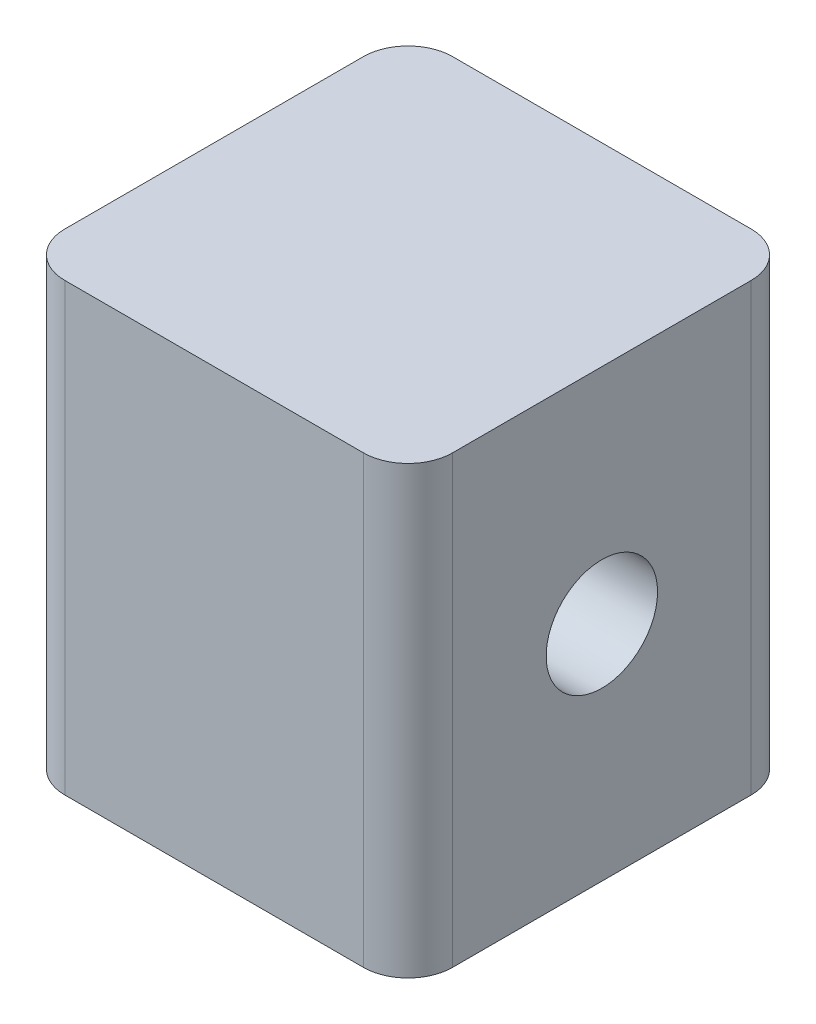
ISO-10303-21;
HEADER;
FILE_DESCRIPTION(('STEP AP214'),'2;1');
FILE_NAME('part.step','',(''),(''),'','','');
FILE_SCHEMA(('AUTOMOTIVE_DESIGN { 1 0 10303 214 1 1 1 1 }'));
ENDSEC;
DATA;
#1=APPLICATION_CONTEXT('core data for automotive mechanical design processes');
#2=APPLICATION_PROTOCOL_DEFINITION('international standard','automotive_design',2000,#1);
#3=PRODUCT_CONTEXT('',#1,'mechanical');
#4=PRODUCT('Part','Part','',(#3));
#5=PRODUCT_RELATED_PRODUCT_CATEGORY('part','',(#4));
#6=PRODUCT_DEFINITION_FORMATION('','',#4);
#7=PRODUCT_DEFINITION_CONTEXT('part definition',#1,'design');
#8=PRODUCT_DEFINITION('design','',#6,#7);
#9=PRODUCT_DEFINITION_SHAPE('','',#8);
#10=(LENGTH_UNIT() NAMED_UNIT(*) SI_UNIT(.MILLI.,.METRE.));
#11=(NAMED_UNIT(*) PLANE_ANGLE_UNIT() SI_UNIT($,.RADIAN.));
#12=(NAMED_UNIT(*) SI_UNIT($,.STERADIAN.) SOLID_ANGLE_UNIT());
#13=UNCERTAINTY_MEASURE_WITH_UNIT(LENGTH_MEASURE(1.E-05),#10,'distance_accuracy_value','');
#14=(GEOMETRIC_REPRESENTATION_CONTEXT(3) GLOBAL_UNCERTAINTY_ASSIGNED_CONTEXT((#13)) GLOBAL_UNIT_ASSIGNED_CONTEXT((#10,
#11,#12)) REPRESENTATION_CONTEXT('',''));
#15=CARTESIAN_POINT('',(0.,0.,0.));
#16=DIRECTION('',(0.,0.,1.));
#17=DIRECTION('',(1.,0.,0.));
#18=AXIS2_PLACEMENT_3D('',#15,#16,#17);
#19=CARTESIAN_POINT('',(11.049,12.7,11.049));
#20=DIRECTION('',(-1.,0.,0.));
#21=DIRECTION('',(0.,0.,1.));
#22=AXIS2_PLACEMENT_3D('',#19,#20,#21);
#23=PLANE('',#22);
#24=CARTESIAN_POINT('',(11.049,0.,0.));
#25=DIRECTION('',(1.,0.,0.));
#26=DIRECTION('',(0.,0.,-1.));
#27=AXIS2_PLACEMENT_3D('',#24,#25,#26);
#28=CIRCLE('',#27,3.175);
#29=CARTESIAN_POINT('',(11.049,0.,-3.175));
#30=VERTEX_POINT('',#29);
#31=EDGE_CURVE('E171',#30,#30,#28,.T.);
#32=ORIENTED_EDGE('',*,*,#31,.F.);
#33=EDGE_LOOP('',(#32));
#34=FACE_BOUND('',#33,.T.);
#35=DIRECTION('',(0.,0.,-1.));
#36=VECTOR('',#35,1.);
#37=CARTESIAN_POINT('',(11.049,12.7,11.049));
#38=LINE('',#37,#36);
#39=CARTESIAN_POINT('',(11.049,12.7,8.509));
#40=VERTEX_POINT('',#39);
#41=CARTESIAN_POINT('',(11.049,12.7,-8.509));
#42=VERTEX_POINT('',#41);
#43=EDGE_CURVE('E131',#40,#42,#38,.T.);
#44=ORIENTED_EDGE('',*,*,#43,.F.);
#45=DIRECTION('',(0.,-1.,0.));
#46=VECTOR('',#45,1.);
#47=CARTESIAN_POINT('',(11.049,12.7,8.509));
#48=LINE('',#47,#46);
#49=CARTESIAN_POINT('',(11.049,-12.7,8.509));
#50=VERTEX_POINT('',#49);
#51=EDGE_CURVE('E157',#40,#50,#48,.T.);
#52=ORIENTED_EDGE('',*,*,#51,.T.);
#53=DIRECTION('',(0.,0.,-1.));
#54=VECTOR('',#53,1.);
#55=CARTESIAN_POINT('',(11.049,-12.7,11.049));
#56=LINE('',#55,#54);
#57=CARTESIAN_POINT('',(11.049,-12.7,-8.509));
#58=VERTEX_POINT('',#57);
#59=EDGE_CURVE('E163',#50,#58,#56,.T.);
#60=ORIENTED_EDGE('',*,*,#59,.T.);
#61=DIRECTION('',(0.,-1.,0.));
#62=VECTOR('',#61,1.);
#63=CARTESIAN_POINT('',(11.049,12.7,-8.509));
#64=LINE('',#63,#62);
#65=EDGE_CURVE('E155',#58,#42,#64,.F.);
#66=ORIENTED_EDGE('',*,*,#65,.T.);
#67=EDGE_LOOP('',(#44,#52,#60,#66));
#68=FACE_BOUND('',#67,.T.);
#69=ADVANCED_FACE('F39',(#34,#68),#23,.F.);
#70=CARTESIAN_POINT('',(-11.049,12.7,-11.049));
#71=DIRECTION('',(0.,0.,1.));
#72=DIRECTION('',(1.,0.,0.));
#73=AXIS2_PLACEMENT_3D('',#70,#71,#72);
#74=PLANE('',#73);
#75=DIRECTION('',(-1.,0.,0.));
#76=VECTOR('',#75,1.);
#77=CARTESIAN_POINT('',(-11.049,12.7,-11.049));
#78=LINE('',#77,#76);
#79=CARTESIAN_POINT('',(8.509,12.7,-11.049));
#80=VERTEX_POINT('',#79);
#81=CARTESIAN_POINT('',(-8.509,12.7,-11.049));
#82=VERTEX_POINT('',#81);
#83=EDGE_CURVE('E134',#80,#82,#78,.T.);
#84=ORIENTED_EDGE('',*,*,#83,.F.);
#85=DIRECTION('',(0.,-1.,0.));
#86=VECTOR('',#85,1.);
#87=CARTESIAN_POINT('',(8.509,12.7,-11.049));
#88=LINE('',#87,#86);
#89=CARTESIAN_POINT('',(8.509,-12.7,-11.049));
#90=VERTEX_POINT('',#89);
#91=EDGE_CURVE('E11',#80,#90,#88,.T.);
#92=ORIENTED_EDGE('',*,*,#91,.T.);
#93=DIRECTION('',(-1.,0.,0.));
#94=VECTOR('',#93,1.);
#95=CARTESIAN_POINT('',(-11.049,-12.7,-11.049));
#96=LINE('',#95,#94);
#97=CARTESIAN_POINT('',(-8.509,-12.7,-11.049));
#98=VERTEX_POINT('',#97);
#99=EDGE_CURVE('E136',#90,#98,#96,.T.);
#100=ORIENTED_EDGE('',*,*,#99,.T.);
#101=DIRECTION('',(0.,-1.,0.));
#102=VECTOR('',#101,1.);
#103=CARTESIAN_POINT('',(-8.509,12.7,-11.049));
#104=LINE('',#103,#102);
#105=EDGE_CURVE('E47',#98,#82,#104,.F.);
#106=ORIENTED_EDGE('',*,*,#105,.T.);
#107=EDGE_LOOP('',(#84,#92,#100,#106));
#108=FACE_BOUND('',#107,.T.);
#109=ADVANCED_FACE('F185',(#108),#74,.F.);
#110=CARTESIAN_POINT('',(-11.049,12.7,11.049));
#111=DIRECTION('',(1.,0.,0.));
#112=DIRECTION('',(0.,0.,-1.));
#113=AXIS2_PLACEMENT_3D('',#110,#111,#112);
#114=PLANE('',#113);
#115=CARTESIAN_POINT('',(-11.049,0.,0.));
#116=DIRECTION('',(1.,0.,0.));
#117=DIRECTION('',(0.,0.,-1.));
#118=AXIS2_PLACEMENT_3D('',#115,#116,#117);
#119=CIRCLE('',#118,3.175);
#120=CARTESIAN_POINT('',(-11.049,0.,-3.175));
#121=VERTEX_POINT('',#120);
#122=EDGE_CURVE('E168',#121,#121,#119,.T.);
#123=ORIENTED_EDGE('',*,*,#122,.T.);
#124=EDGE_LOOP('',(#123));
#125=FACE_BOUND('',#124,.T.);
#126=DIRECTION('',(0.,0.,1.));
#127=VECTOR('',#126,1.);
#128=CARTESIAN_POINT('',(-11.049,-12.7,11.049));
#129=LINE('',#128,#127);
#130=CARTESIAN_POINT('',(-11.049,-12.7,-8.509));
#131=VERTEX_POINT('',#130);
#132=CARTESIAN_POINT('',(-11.049,-12.7,8.509));
#133=VERTEX_POINT('',#132);
#134=EDGE_CURVE('E132',#131,#133,#129,.T.);
#135=ORIENTED_EDGE('',*,*,#134,.T.);
#136=DIRECTION('',(0.,-1.,0.));
#137=VECTOR('',#136,1.);
#138=CARTESIAN_POINT('',(-11.049,12.7,8.509));
#139=LINE('',#138,#137);
#140=CARTESIAN_POINT('',(-11.049,12.7,8.509));
#141=VERTEX_POINT('',#140);
#142=EDGE_CURVE('E110',#133,#141,#139,.F.);
#143=ORIENTED_EDGE('',*,*,#142,.T.);
#144=DIRECTION('',(0.,0.,1.));
#145=VECTOR('',#144,1.);
#146=CARTESIAN_POINT('',(-11.049,12.7,11.049));
#147=LINE('',#146,#145);
#148=CARTESIAN_POINT('',(-11.049,12.7,-8.509));
#149=VERTEX_POINT('',#148);
#150=EDGE_CURVE('E175',#149,#141,#147,.T.);
#151=ORIENTED_EDGE('',*,*,#150,.F.);
#152=DIRECTION('',(0.,-1.,0.));
#153=VECTOR('',#152,1.);
#154=CARTESIAN_POINT('',(-11.049,12.7,-8.509));
#155=LINE('',#154,#153);
#156=EDGE_CURVE('E115',#149,#131,#155,.T.);
#157=ORIENTED_EDGE('',*,*,#156,.T.);
#158=EDGE_LOOP('',(#135,#143,#151,#157));
#159=FACE_BOUND('',#158,.T.);
#160=ADVANCED_FACE('F192',(#125,#159),#114,.F.);
#161=CARTESIAN_POINT('',(-11.049,12.7,11.049));
#162=DIRECTION('',(0.,0.,-1.));
#163=DIRECTION('',(-1.,0.,0.));
#164=AXIS2_PLACEMENT_3D('',#161,#162,#163);
#165=PLANE('',#164);
#166=DIRECTION('',(1.,0.,0.));
#167=VECTOR('',#166,1.);
#168=CARTESIAN_POINT('',(-11.049,12.7,11.049));
#169=LINE('',#168,#167);
#170=CARTESIAN_POINT('',(-8.509,12.7,11.049));
#171=VERTEX_POINT('',#170);
#172=CARTESIAN_POINT('',(8.509,12.7,11.049));
#173=VERTEX_POINT('',#172);
#174=EDGE_CURVE('E125',#171,#173,#169,.T.);
#175=ORIENTED_EDGE('',*,*,#174,.F.);
#176=DIRECTION('',(0.,-1.,0.));
#177=VECTOR('',#176,1.);
#178=CARTESIAN_POINT('',(-8.509,12.7,11.049));
#179=LINE('',#178,#177);
#180=CARTESIAN_POINT('',(-8.509,-12.7,11.049));
#181=VERTEX_POINT('',#180);
#182=EDGE_CURVE('E109',#171,#181,#179,.T.);
#183=ORIENTED_EDGE('',*,*,#182,.T.);
#184=DIRECTION('',(1.,0.,0.));
#185=VECTOR('',#184,1.);
#186=CARTESIAN_POINT('',(-11.049,-12.7,11.049));
#187=LINE('',#186,#185);
#188=CARTESIAN_POINT('',(8.509,-12.7,11.049));
#189=VERTEX_POINT('',#188);
#190=EDGE_CURVE('E122',#181,#189,#187,.T.);
#191=ORIENTED_EDGE('',*,*,#190,.T.);
#192=DIRECTION('',(0.,-1.,0.));
#193=VECTOR('',#192,1.);
#194=CARTESIAN_POINT('',(8.509,12.7,11.049));
#195=LINE('',#194,#193);
#196=EDGE_CURVE('E127',#189,#173,#195,.F.);
#197=ORIENTED_EDGE('',*,*,#196,.T.);
#198=EDGE_LOOP('',(#175,#183,#191,#197));
#199=FACE_BOUND('',#198,.T.);
#200=ADVANCED_FACE('F121',(#199),#165,.F.);
#201=CARTESIAN_POINT('',(0.,12.7,0.));
#202=DIRECTION('',(0.,-1.,0.));
#203=DIRECTION('',(0.,0.,-1.));
#204=AXIS2_PLACEMENT_3D('',#201,#202,#203);
#205=PLANE('',#204);
#206=ORIENTED_EDGE('',*,*,#150,.T.);
#207=CARTESIAN_POINT('',(-8.509,12.7,8.509));
#208=DIRECTION('',(0.,-1.,0.));
#209=DIRECTION('',(0.,0.,-1.));
#210=AXIS2_PLACEMENT_3D('',#207,#208,#209);
#211=CIRCLE('',#210,2.54);
#212=EDGE_CURVE('E153',#141,#171,#211,.F.);
#213=ORIENTED_EDGE('',*,*,#212,.T.);
#214=ORIENTED_EDGE('',*,*,#174,.T.);
#215=CARTESIAN_POINT('',(8.509,12.7,8.509));
#216=DIRECTION('',(0.,-1.,0.));
#217=DIRECTION('',(0.,0.,-1.));
#218=AXIS2_PLACEMENT_3D('',#215,#216,#217);
#219=CIRCLE('',#218,2.54);
#220=EDGE_CURVE('E151',#173,#40,#219,.F.);
#221=ORIENTED_EDGE('',*,*,#220,.T.);
#222=ORIENTED_EDGE('',*,*,#43,.T.);
#223=CARTESIAN_POINT('',(8.509,12.7,-8.509));
#224=DIRECTION('',(0.,-1.,0.));
#225=DIRECTION('',(0.,0.,-1.));
#226=AXIS2_PLACEMENT_3D('',#223,#224,#225);
#227=CIRCLE('',#226,2.54);
#228=EDGE_CURVE('E60',#42,#80,#227,.F.);
#229=ORIENTED_EDGE('',*,*,#228,.T.);
#230=ORIENTED_EDGE('',*,*,#83,.T.);
#231=CARTESIAN_POINT('',(-8.509,12.7,-8.509));
#232=DIRECTION('',(0.,-1.,0.));
#233=DIRECTION('',(0.,0.,-1.));
#234=AXIS2_PLACEMENT_3D('',#231,#232,#233);
#235=CIRCLE('',#234,2.54);
#236=EDGE_CURVE('E148',#82,#149,#235,.F.);
#237=ORIENTED_EDGE('',*,*,#236,.T.);
#238=EDGE_LOOP('',(#206,#213,#214,#221,#222,#229,#230,#237));
#239=FACE_BOUND('',#238,.T.);
#240=ADVANCED_FACE('F211',(#239),#205,.F.);
#241=CARTESIAN_POINT('',(0.,-12.7,0.));
#242=DIRECTION('',(0.,-1.,0.));
#243=DIRECTION('',(0.,0.,-1.));
#244=AXIS2_PLACEMENT_3D('',#241,#242,#243);
#245=PLANE('',#244);
#246=ORIENTED_EDGE('',*,*,#190,.F.);
#247=CARTESIAN_POINT('',(-8.509,-12.7,8.509));
#248=DIRECTION('',(0.,-1.,0.));
#249=DIRECTION('',(0.,0.,-1.));
#250=AXIS2_PLACEMENT_3D('',#247,#248,#249);
#251=CIRCLE('',#250,2.54);
#252=EDGE_CURVE('E105',#181,#133,#251,.T.);
#253=ORIENTED_EDGE('',*,*,#252,.T.);
#254=ORIENTED_EDGE('',*,*,#134,.F.);
#255=CARTESIAN_POINT('',(-8.509,-12.7,-8.509));
#256=DIRECTION('',(0.,-1.,0.));
#257=DIRECTION('',(0.,0.,-1.));
#258=AXIS2_PLACEMENT_3D('',#255,#256,#257);
#259=CIRCLE('',#258,2.54);
#260=EDGE_CURVE('E126',#131,#98,#259,.T.);
#261=ORIENTED_EDGE('',*,*,#260,.T.);
#262=ORIENTED_EDGE('',*,*,#99,.F.);
#263=CARTESIAN_POINT('',(8.509,-12.7,-8.509));
#264=DIRECTION('',(0.,-1.,0.));
#265=DIRECTION('',(0.,0.,-1.));
#266=AXIS2_PLACEMENT_3D('',#263,#264,#265);
#267=CIRCLE('',#266,2.54);
#268=EDGE_CURVE('E142',#90,#58,#267,.T.);
#269=ORIENTED_EDGE('',*,*,#268,.T.);
#270=ORIENTED_EDGE('',*,*,#59,.F.);
#271=CARTESIAN_POINT('',(8.509,-12.7,8.509));
#272=DIRECTION('',(0.,-1.,0.));
#273=DIRECTION('',(0.,0.,-1.));
#274=AXIS2_PLACEMENT_3D('',#271,#272,#273);
#275=CIRCLE('',#274,2.54);
#276=EDGE_CURVE('E116',#50,#189,#275,.T.);
#277=ORIENTED_EDGE('',*,*,#276,.T.);
#278=EDGE_LOOP('',(#246,#253,#254,#261,#262,#269,#270,#277));
#279=FACE_BOUND('',#278,.T.);
#280=ADVANCED_FACE('F129',(#279),#245,.T.);
#281=CARTESIAN_POINT('',(-8.509,12.7,8.509));
#282=DIRECTION('',(0.,-1.,0.));
#283=DIRECTION('',(0.,0.,-1.));
#284=AXIS2_PLACEMENT_3D('',#281,#282,#283);
#285=CYLINDRICAL_SURFACE('',#284,2.54);
#286=ORIENTED_EDGE('',*,*,#212,.F.);
#287=ORIENTED_EDGE('',*,*,#142,.F.);
#288=ORIENTED_EDGE('',*,*,#252,.F.);
#289=ORIENTED_EDGE('',*,*,#182,.F.);
#290=EDGE_LOOP('',(#286,#287,#288,#289));
#291=FACE_BOUND('',#290,.T.);
#292=ADVANCED_FACE('F108',(#291),#285,.T.);
#293=CARTESIAN_POINT('',(8.509,12.7,8.509));
#294=DIRECTION('',(0.,-1.,0.));
#295=DIRECTION('',(0.,0.,-1.));
#296=AXIS2_PLACEMENT_3D('',#293,#294,#295);
#297=CYLINDRICAL_SURFACE('',#296,2.54);
#298=ORIENTED_EDGE('',*,*,#220,.F.);
#299=ORIENTED_EDGE('',*,*,#196,.F.);
#300=ORIENTED_EDGE('',*,*,#276,.F.);
#301=ORIENTED_EDGE('',*,*,#51,.F.);
#302=EDGE_LOOP('',(#298,#299,#300,#301));
#303=FACE_BOUND('',#302,.T.);
#304=ADVANCED_FACE('F198',(#303),#297,.T.);
#305=CARTESIAN_POINT('',(8.509,12.7,-8.509));
#306=DIRECTION('',(0.,-1.,0.));
#307=DIRECTION('',(0.,0.,-1.));
#308=AXIS2_PLACEMENT_3D('',#305,#306,#307);
#309=CYLINDRICAL_SURFACE('',#308,2.54);
#310=ORIENTED_EDGE('',*,*,#228,.F.);
#311=ORIENTED_EDGE('',*,*,#65,.F.);
#312=ORIENTED_EDGE('',*,*,#268,.F.);
#313=ORIENTED_EDGE('',*,*,#91,.F.);
#314=EDGE_LOOP('',(#310,#311,#312,#313));
#315=FACE_BOUND('',#314,.T.);
#316=ADVANCED_FACE('F200',(#315),#309,.T.);
#317=CARTESIAN_POINT('',(-8.509,12.7,-8.509));
#318=DIRECTION('',(0.,-1.,0.));
#319=DIRECTION('',(0.,0.,-1.));
#320=AXIS2_PLACEMENT_3D('',#317,#318,#319);
#321=CYLINDRICAL_SURFACE('',#320,2.54);
#322=ORIENTED_EDGE('',*,*,#236,.F.);
#323=ORIENTED_EDGE('',*,*,#105,.F.);
#324=ORIENTED_EDGE('',*,*,#260,.F.);
#325=ORIENTED_EDGE('',*,*,#156,.F.);
#326=EDGE_LOOP('',(#322,#323,#324,#325));
#327=FACE_BOUND('',#326,.T.);
#328=ADVANCED_FACE('F41',(#327),#321,.T.);
#329=CARTESIAN_POINT('',(-11.049,0.,0.));
#330=DIRECTION('',(1.,0.,0.));
#331=DIRECTION('',(0.,0.,-1.));
#332=AXIS2_PLACEMENT_3D('',#329,#330,#331);
#333=CYLINDRICAL_SURFACE('',#332,3.175);
#334=ORIENTED_EDGE('',*,*,#122,.F.);
#335=EDGE_LOOP('',(#334));
#336=FACE_BOUND('',#335,.T.);
#337=ORIENTED_EDGE('',*,*,#31,.T.);
#338=EDGE_LOOP('',(#337));
#339=FACE_BOUND('',#338,.T.);
#340=ADVANCED_FACE('F182',(#336,#339),#333,.F.);
#341=CLOSED_SHELL('',(#69,#109,#160,#200,#240,#280,#292,#304,#316,#328,#340));
#342=MANIFOLD_SOLID_BREP('B2',#341);
#343=ADVANCED_BREP_SHAPE_REPRESENTATION('',(#18,#342),#14);
#344=SHAPE_DEFINITION_REPRESENTATION(#9,#343);
ENDSEC;
END-ISO-10303-21;
